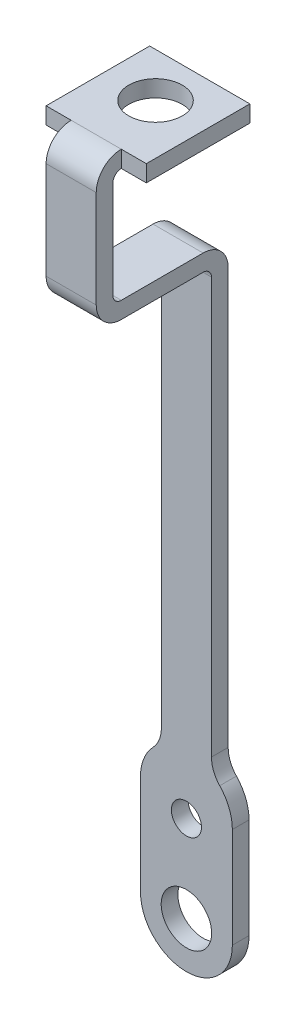
ISO-10303-21;
HEADER;
FILE_DESCRIPTION(('STEP AP214'),'2;1');
FILE_NAME('part.step','',(''),(''),'','','');
FILE_SCHEMA(('AUTOMOTIVE_DESIGN { 1 0 10303 214 1 1 1 1 }'));
ENDSEC;
DATA;
#1=APPLICATION_CONTEXT('core data for automotive mechanical design processes');
#2=APPLICATION_PROTOCOL_DEFINITION('international standard','automotive_design',2000,#1);
#3=PRODUCT_CONTEXT('',#1,'mechanical');
#4=PRODUCT('Part','Part','',(#3));
#5=PRODUCT_RELATED_PRODUCT_CATEGORY('part','',(#4));
#6=PRODUCT_DEFINITION_FORMATION('','',#4);
#7=PRODUCT_DEFINITION_CONTEXT('part definition',#1,'design');
#8=PRODUCT_DEFINITION('design','',#6,#7);
#9=PRODUCT_DEFINITION_SHAPE('','',#8);
#10=(LENGTH_UNIT() NAMED_UNIT(*) SI_UNIT(.MILLI.,.METRE.));
#11=(NAMED_UNIT(*) PLANE_ANGLE_UNIT() SI_UNIT($,.RADIAN.));
#12=(NAMED_UNIT(*) SI_UNIT($,.STERADIAN.) SOLID_ANGLE_UNIT());
#13=UNCERTAINTY_MEASURE_WITH_UNIT(LENGTH_MEASURE(1.E-05),#10,'distance_accuracy_value','');
#14=(GEOMETRIC_REPRESENTATION_CONTEXT(3) GLOBAL_UNCERTAINTY_ASSIGNED_CONTEXT((#13)) GLOBAL_UNIT_ASSIGNED_CONTEXT((#10,
#11,#12)) REPRESENTATION_CONTEXT('',''));
#15=CARTESIAN_POINT('',(0.,0.,0.));
#16=DIRECTION('',(0.,0.,1.));
#17=DIRECTION('',(1.,0.,0.));
#18=AXIS2_PLACEMENT_3D('',#15,#16,#17);
#19=CARTESIAN_POINT('',(-1.57295327545314E-12,-48.1509999999978,1.));
#20=DIRECTION('',(0.,0.,-1.));
#21=DIRECTION('',(-1.,0.,0.));
#22=AXIS2_PLACEMENT_3D('',#19,#20,#21);
#23=CYLINDRICAL_SURFACE('',#22,2.7499999999994);
#24=CARTESIAN_POINT('',(-1.57295327545314E-12,-48.1509999999978,0.));
#25=DIRECTION('',(0.,0.,1.));
#26=DIRECTION('',(1.,0.,0.));
#27=AXIS2_PLACEMENT_3D('',#24,#25,#26);
#28=CIRCLE('',#27,2.7499999999994);
#29=CARTESIAN_POINT('',(-2.75000000000148,-48.1509999999978,0.));
#30=VERTEX_POINT('',#29);
#31=CARTESIAN_POINT('',(2.75000000000148,-48.1509999999978,0.));
#32=VERTEX_POINT('',#31);
#33=EDGE_CURVE('E303',#30,#32,#28,.T.);
#34=ORIENTED_EDGE('',*,*,#33,.T.);
#35=DIRECTION('',(0.,0.,-1.));
#36=VECTOR('',#35,1.);
#37=CARTESIAN_POINT('',(2.75000000000148,-48.1509999999978,1.));
#38=LINE('',#37,#36);
#39=CARTESIAN_POINT('',(2.75000000000148,-48.1509999999978,1.));
#40=VERTEX_POINT('',#39);
#41=EDGE_CURVE('E246',#40,#32,#38,.T.);
#42=ORIENTED_EDGE('',*,*,#41,.F.);
#43=CARTESIAN_POINT('',(-1.57295327545314E-12,-48.1509999999978,1.));
#44=DIRECTION('',(0.,0.,1.));
#45=DIRECTION('',(1.,0.,0.));
#46=AXIS2_PLACEMENT_3D('',#43,#44,#45);
#47=CIRCLE('',#46,2.7499999999994);
#48=CARTESIAN_POINT('',(-2.75000000000148,-48.1509999999978,1.));
#49=VERTEX_POINT('',#48);
#50=EDGE_CURVE('E305',#49,#40,#47,.T.);
#51=ORIENTED_EDGE('',*,*,#50,.F.);
#52=DIRECTION('',(0.,0.,-1.));
#53=VECTOR('',#52,1.);
#54=CARTESIAN_POINT('',(-2.75000000000148,-48.1509999999978,1.));
#55=LINE('',#54,#53);
#56=EDGE_CURVE('E320',#49,#30,#55,.T.);
#57=ORIENTED_EDGE('',*,*,#56,.T.);
#58=EDGE_LOOP('',(#34,#42,#51,#57));
#59=FACE_BOUND('',#58,.T.);
#60=ADVANCED_FACE('F36',(#59),#23,.T.);
#61=CARTESIAN_POINT('',(-1.57295327545314E-12,-48.1509999999978,1.));
#62=DIRECTION('',(0.,0.,-1.));
#63=DIRECTION('',(-1.,0.,0.));
#64=AXIS2_PLACEMENT_3D('',#61,#62,#63);
#65=CYLINDRICAL_SURFACE('',#64,1.51000000000107);
#66=CARTESIAN_POINT('',(-1.57295327545314E-12,-48.1509999999978,0.));
#67=DIRECTION('',(0.,0.,-1.));
#68=DIRECTION('',(1.,0.,0.));
#69=AXIS2_PLACEMENT_3D('',#66,#67,#68);
#70=CIRCLE('',#69,1.51000000000107);
#71=CARTESIAN_POINT('',(1.5099999999995,-48.1509999999978,0.));
#72=VERTEX_POINT('',#71);
#73=EDGE_CURVE('E322',#72,#72,#70,.T.);
#74=ORIENTED_EDGE('',*,*,#73,.T.);
#75=EDGE_LOOP('',(#74));
#76=FACE_BOUND('',#75,.T.);
#77=CARTESIAN_POINT('',(-1.57295327545314E-12,-48.1509999999978,1.));
#78=DIRECTION('',(0.,0.,-1.));
#79=DIRECTION('',(1.,0.,0.));
#80=AXIS2_PLACEMENT_3D('',#77,#78,#79);
#81=CIRCLE('',#80,1.51000000000107);
#82=CARTESIAN_POINT('',(1.5099999999995,-48.1509999999978,1.));
#83=VERTEX_POINT('',#82);
#84=EDGE_CURVE('E307',#83,#83,#81,.T.);
#85=ORIENTED_EDGE('',*,*,#84,.F.);
#86=EDGE_LOOP('',(#85));
#87=FACE_BOUND('',#86,.T.);
#88=ADVANCED_FACE('F457',(#76,#87),#65,.F.);
#89=CARTESIAN_POINT('',(-3.49497688161806E-12,-42.9580299744084,1.));
#90=DIRECTION('',(0.,0.,-1.));
#91=DIRECTION('',(-1.,0.,0.));
#92=AXIS2_PLACEMENT_3D('',#89,#90,#91);
#93=CYLINDRICAL_SURFACE('',#92,0.899999999999998);
#94=CARTESIAN_POINT('',(-3.49497688161806E-12,-42.9580299744084,0.));
#95=DIRECTION('',(0.,0.,-1.));
#96=DIRECTION('',(1.,0.,0.));
#97=AXIS2_PLACEMENT_3D('',#94,#95,#96);
#98=CIRCLE('',#97,0.899999999999998);
#99=CARTESIAN_POINT('',(0.899999999996503,-42.9580299744084,0.));
#100=VERTEX_POINT('',#99);
#101=EDGE_CURVE('E325',#100,#100,#98,.T.);
#102=ORIENTED_EDGE('',*,*,#101,.T.);
#103=EDGE_LOOP('',(#102));
#104=FACE_BOUND('',#103,.T.);
#105=CARTESIAN_POINT('',(-3.49497688161806E-12,-42.9580299744084,1.));
#106=DIRECTION('',(0.,0.,-1.));
#107=DIRECTION('',(1.,0.,0.));
#108=AXIS2_PLACEMENT_3D('',#105,#106,#107);
#109=CIRCLE('',#108,0.899999999999998);
#110=CARTESIAN_POINT('',(0.899999999996503,-42.9580299744084,1.));
#111=VERTEX_POINT('',#110);
#112=EDGE_CURVE('E311',#111,#111,#109,.T.);
#113=ORIENTED_EDGE('',*,*,#112,.F.);
#114=EDGE_LOOP('',(#113));
#115=FACE_BOUND('',#114,.T.);
#116=ADVANCED_FACE('F463',(#104,#115),#93,.F.);
#117=CARTESIAN_POINT('',(-1.50000000000157,-12.6339999999955,1.));
#118=DIRECTION('',(0.,-1.,0.));
#119=DIRECTION('',(0.,0.,-1.));
#120=AXIS2_PLACEMENT_3D('',#117,#118,#119);
#121=PLANE('',#120);
#122=DIRECTION('',(0.,0.,-1.));
#123=VECTOR('',#122,1.);
#124=CARTESIAN_POINT('',(1.50000000000157,-12.6339999999955,1.));
#125=LINE('',#124,#123);
#126=CARTESIAN_POINT('',(1.50000000000157,-12.6339999999955,6.4));
#127=VERTEX_POINT('',#126);
#128=CARTESIAN_POINT('',(1.50000000000157,-12.6339999999955,1.5));
#129=VERTEX_POINT('',#128);
#130=EDGE_CURVE('E258',#127,#129,#125,.T.);
#131=ORIENTED_EDGE('',*,*,#130,.T.);
#132=DIRECTION('',(-1.,0.,0.));
#133=VECTOR('',#132,1.);
#134=CARTESIAN_POINT('',(-1.50000000000157,-12.6339999999955,1.5));
#135=LINE('',#134,#133);
#136=CARTESIAN_POINT('',(-1.50000000000157,-12.6339999999955,1.5));
#137=VERTEX_POINT('',#136);
#138=EDGE_CURVE('E379',#129,#137,#135,.T.);
#139=ORIENTED_EDGE('',*,*,#138,.T.);
#140=DIRECTION('',(0.,0.,-1.));
#141=VECTOR('',#140,1.);
#142=CARTESIAN_POINT('',(-1.50000000000157,-12.6339999999955,1.));
#143=LINE('',#142,#141);
#144=CARTESIAN_POINT('',(-1.50000000000157,-12.6339999999955,6.4));
#145=VERTEX_POINT('',#144);
#146=EDGE_CURVE('E338',#145,#137,#143,.T.);
#147=ORIENTED_EDGE('',*,*,#146,.F.);
#148=DIRECTION('',(1.,0.,0.));
#149=VECTOR('',#148,1.);
#150=CARTESIAN_POINT('',(-1.50000000000157,-12.6339999999955,6.4));
#151=LINE('',#150,#149);
#152=EDGE_CURVE('E364',#145,#127,#151,.T.);
#153=ORIENTED_EDGE('',*,*,#152,.T.);
#154=EDGE_LOOP('',(#131,#139,#147,#153));
#155=FACE_BOUND('',#154,.T.);
#156=ADVANCED_FACE('F539',(#155),#121,.F.);
#157=CARTESIAN_POINT('',(-1.50000000000157,-12.6339999999955,1.));
#158=DIRECTION('',(1.,0.,0.));
#159=DIRECTION('',(0.,1.,0.));
#160=AXIS2_PLACEMENT_3D('',#157,#158,#159);
#161=PLANE('',#160);
#162=ORIENTED_EDGE('',*,*,#146,.T.);
#163=CARTESIAN_POINT('',(-1.50000000000157,-14.1339999999955,1.5));
#164=DIRECTION('',(1.,0.,0.));
#165=DIRECTION('',(0.,1.,0.));
#166=AXIS2_PLACEMENT_3D('',#163,#164,#165);
#167=CIRCLE('',#166,1.5);
#168=CARTESIAN_POINT('',(-1.50000000000157,-14.1339999999955,0.));
#169=VERTEX_POINT('',#168);
#170=EDGE_CURVE('E386',#137,#169,#167,.F.);
#171=ORIENTED_EDGE('',*,*,#170,.T.);
#172=DIRECTION('',(0.,-1.,0.));
#173=VECTOR('',#172,1.);
#174=CARTESIAN_POINT('',(-1.50000000000157,-12.6339999999955,0.));
#175=LINE('',#174,#173);
#176=CARTESIAN_POINT('',(-1.50000000000157,-39.0185089784614,0.));
#177=VERTEX_POINT('',#176);
#178=EDGE_CURVE('E328',#169,#177,#175,.T.);
#179=ORIENTED_EDGE('',*,*,#178,.T.);
#180=DIRECTION('',(0.,0.,1.));
#181=VECTOR('',#180,1.);
#182=CARTESIAN_POINT('',(-1.50000000000157,-39.0185089784614,1.));
#183=LINE('',#182,#181);
#184=CARTESIAN_POINT('',(-1.50000000000157,-39.0185089784614,1.));
#185=VERTEX_POINT('',#184);
#186=EDGE_CURVE('E344',#177,#185,#183,.T.);
#187=ORIENTED_EDGE('',*,*,#186,.T.);
#188=DIRECTION('',(0.,-1.,0.));
#189=VECTOR('',#188,1.);
#190=CARTESIAN_POINT('',(-1.50000000000157,-12.6339999999955,1.));
#191=LINE('',#190,#189);
#192=CARTESIAN_POINT('',(-1.50000000000157,-14.1339999999955,1.));
#193=VERTEX_POINT('',#192);
#194=EDGE_CURVE('E314',#193,#185,#191,.T.);
#195=ORIENTED_EDGE('',*,*,#194,.F.);
#196=CARTESIAN_POINT('',(-1.50000000000157,-14.1339999999955,1.5));
#197=DIRECTION('',(1.,0.,0.));
#198=DIRECTION('',(0.,1.,0.));
#199=AXIS2_PLACEMENT_3D('',#196,#197,#198);
#200=CIRCLE('',#199,0.5);
#201=CARTESIAN_POINT('',(-1.50000000000157,-13.6339999999955,1.5));
#202=VERTEX_POINT('',#201);
#203=EDGE_CURVE('E369',#193,#202,#200,.T.);
#204=ORIENTED_EDGE('',*,*,#203,.T.);
#205=DIRECTION('',(0.,0.,1.));
#206=VECTOR('',#205,1.);
#207=CARTESIAN_POINT('',(-1.50000000000157,-13.6339999999955,0.));
#208=LINE('',#207,#206);
#209=CARTESIAN_POINT('',(-1.50000000000157,-13.6339999999955,6.4));
#210=VERTEX_POINT('',#209);
#211=EDGE_CURVE('E300',#202,#210,#208,.T.);
#212=ORIENTED_EDGE('',*,*,#211,.T.);
#213=CARTESIAN_POINT('',(-1.50000000000157,-12.1339999999955,6.4));
#214=DIRECTION('',(1.,0.,0.));
#215=DIRECTION('',(0.,1.,0.));
#216=AXIS2_PLACEMENT_3D('',#213,#214,#215);
#217=CIRCLE('',#216,1.5);
#218=CARTESIAN_POINT('',(-1.50000000000157,-12.1339999999955,7.9));
#219=VERTEX_POINT('',#218);
#220=EDGE_CURVE('E382',#210,#219,#217,.F.);
#221=ORIENTED_EDGE('',*,*,#220,.T.);
#222=DIRECTION('',(0.,1.,0.));
#223=VECTOR('',#222,1.);
#224=CARTESIAN_POINT('',(-1.50000000000157,-13.6339999999955,7.9));
#225=LINE('',#224,#223);
#226=CARTESIAN_POINT('',(-1.50000000000157,-6.29999999999704,7.9));
#227=VERTEX_POINT('',#226);
#228=EDGE_CURVE('E297',#219,#227,#225,.T.);
#229=ORIENTED_EDGE('',*,*,#228,.T.);
#230=CARTESIAN_POINT('',(-1.50000000000157,-6.29999999999704,6.4));
#231=DIRECTION('',(1.,0.,0.));
#232=DIRECTION('',(0.,1.,0.));
#233=AXIS2_PLACEMENT_3D('',#230,#231,#232);
#234=CIRCLE('',#233,1.5);
#235=CARTESIAN_POINT('',(-1.50000000000157,-4.79999999999704,6.4));
#236=VERTEX_POINT('',#235);
#237=EDGE_CURVE('E384',#227,#236,#234,.F.);
#238=ORIENTED_EDGE('',*,*,#237,.T.);
#239=DIRECTION('',(0.,1.,0.));
#240=VECTOR('',#239,1.);
#241=CARTESIAN_POINT('',(-1.50000000000157,-12.1788713735235,6.4));
#242=LINE('',#241,#240);
#243=CARTESIAN_POINT('',(-1.50000000000157,-5.79999999999704,6.4));
#244=VERTEX_POINT('',#243);
#245=EDGE_CURVE('E208',#244,#236,#242,.T.);
#246=ORIENTED_EDGE('',*,*,#245,.F.);
#247=CARTESIAN_POINT('',(-1.50000000000157,-6.29999999999704,6.4));
#248=DIRECTION('',(1.,0.,0.));
#249=DIRECTION('',(0.,1.,0.));
#250=AXIS2_PLACEMENT_3D('',#247,#248,#249);
#251=CIRCLE('',#250,0.5);
#252=CARTESIAN_POINT('',(-1.50000000000157,-6.29999999999704,6.9));
#253=VERTEX_POINT('',#252);
#254=EDGE_CURVE('E373',#244,#253,#251,.T.);
#255=ORIENTED_EDGE('',*,*,#254,.T.);
#256=DIRECTION('',(0.,-1.,0.));
#257=VECTOR('',#256,1.);
#258=CARTESIAN_POINT('',(-1.50000000000157,-12.6339999999955,6.9));
#259=LINE('',#258,#257);
#260=CARTESIAN_POINT('',(-1.50000000000157,-12.1339999999955,6.9));
#261=VERTEX_POINT('',#260);
#262=EDGE_CURVE('E294',#253,#261,#259,.T.);
#263=ORIENTED_EDGE('',*,*,#262,.T.);
#264=CARTESIAN_POINT('',(-1.50000000000157,-12.1339999999955,6.4));
#265=DIRECTION('',(1.,0.,0.));
#266=DIRECTION('',(0.,1.,0.));
#267=AXIS2_PLACEMENT_3D('',#264,#265,#266);
#268=CIRCLE('',#267,0.5);
#269=EDGE_CURVE('E377',#261,#145,#268,.T.);
#270=ORIENTED_EDGE('',*,*,#269,.T.);
#271=EDGE_LOOP('',(#162,#171,#179,#187,#195,#204,#212,#221,#229,#238,#246,#255,#263,#270));
#272=FACE_BOUND('',#271,.T.);
#273=ADVANCED_FACE('F407',(#272),#161,.F.);
#274=CARTESIAN_POINT('',(-2.49856129121515E-12,-42.1509999999963,1.));
#275=DIRECTION('',(0.,0.,-1.));
#276=DIRECTION('',(-1.,0.,0.));
#277=AXIS2_PLACEMENT_3D('',#274,#275,#276);
#278=CYLINDRICAL_SURFACE('',#277,2.74999999999895);
#279=CARTESIAN_POINT('',(-2.49856129121515E-12,-42.1509999999963,1.));
#280=DIRECTION('',(0.,0.,1.));
#281=DIRECTION('',(1.,0.,0.));
#282=AXIS2_PLACEMENT_3D('',#279,#280,#281);
#283=CIRCLE('',#282,2.74999999999895);
#284=CARTESIAN_POINT('',(-1.99450549450713,-40.2577361957722,1.));
#285=VERTEX_POINT('',#284);
#286=CARTESIAN_POINT('',(-2.75000000000145,-42.1509999999963,1.));
#287=VERTEX_POINT('',#286);
#288=EDGE_CURVE('E316',#285,#287,#283,.T.);
#289=ORIENTED_EDGE('',*,*,#288,.F.);
#290=DIRECTION('',(0.,0.,-1.));
#291=VECTOR('',#290,1.);
#292=CARTESIAN_POINT('',(-1.99450549450713,-40.2577361957722,1.));
#293=LINE('',#292,#291);
#294=CARTESIAN_POINT('',(-1.99450549450713,-40.2577361957722,0.));
#295=VERTEX_POINT('',#294);
#296=EDGE_CURVE('E341',#285,#295,#293,.T.);
#297=ORIENTED_EDGE('',*,*,#296,.T.);
#298=CARTESIAN_POINT('',(-2.49856129121515E-12,-42.1509999999963,0.));
#299=DIRECTION('',(0.,0.,1.));
#300=DIRECTION('',(1.,0.,0.));
#301=AXIS2_PLACEMENT_3D('',#298,#299,#300);
#302=CIRCLE('',#301,2.74999999999895);
#303=CARTESIAN_POINT('',(-2.75000000000145,-42.1509999999963,0.));
#304=VERTEX_POINT('',#303);
#305=EDGE_CURVE('E330',#295,#304,#302,.T.);
#306=ORIENTED_EDGE('',*,*,#305,.T.);
#307=DIRECTION('',(0.,0.,-1.));
#308=VECTOR('',#307,1.);
#309=CARTESIAN_POINT('',(-2.75000000000145,-42.1509999999963,1.));
#310=LINE('',#309,#308);
#311=EDGE_CURVE('E335',#287,#304,#310,.T.);
#312=ORIENTED_EDGE('',*,*,#311,.F.);
#313=EDGE_LOOP('',(#289,#297,#306,#312));
#314=FACE_BOUND('',#313,.T.);
#315=ADVANCED_FACE('F491',(#314),#278,.T.);
#316=CARTESIAN_POINT('',(-2.75000000000148,-48.1509999999978,1.));
#317=DIRECTION('',(1.,0.,0.));
#318=DIRECTION('',(0.,0.,-1.));
#319=AXIS2_PLACEMENT_3D('',#316,#317,#318);
#320=PLANE('',#319);
#321=DIRECTION('',(0.,-1.,0.));
#322=VECTOR('',#321,1.);
#323=CARTESIAN_POINT('',(-2.75000000000148,-48.1509999999978,0.));
#324=LINE('',#323,#322);
#325=EDGE_CURVE('E308',#304,#30,#324,.T.);
#326=ORIENTED_EDGE('',*,*,#325,.T.);
#327=ORIENTED_EDGE('',*,*,#56,.F.);
#328=DIRECTION('',(0.,-1.,0.));
#329=VECTOR('',#328,1.);
#330=CARTESIAN_POINT('',(-2.75000000000148,-48.1509999999978,1.));
#331=LINE('',#330,#329);
#332=EDGE_CURVE('E318',#287,#49,#331,.T.);
#333=ORIENTED_EDGE('',*,*,#332,.F.);
#334=ORIENTED_EDGE('',*,*,#311,.T.);
#335=EDGE_LOOP('',(#326,#327,#333,#334));
#336=FACE_BOUND('',#335,.T.);
#337=ADVANCED_FACE('F497',(#336),#320,.F.);
#338=CARTESIAN_POINT('',(-1.57295327545314E-12,-48.1509999999978,1.));
#339=DIRECTION('',(0.,0.,1.));
#340=DIRECTION('',(1.,0.,0.));
#341=AXIS2_PLACEMENT_3D('',#338,#339,#340);
#342=PLANE('',#341);
#343=DIRECTION('',(0.,-1.,0.));
#344=VECTOR('',#343,1.);
#345=CARTESIAN_POINT('',(1.50000000000157,-12.6339999999955,1.));
#346=LINE('',#345,#344);
#347=CARTESIAN_POINT('',(1.50000000000157,-14.1339999999955,1.));
#348=VERTEX_POINT('',#347);
#349=CARTESIAN_POINT('',(1.50000000000157,-39.0185089784614,1.));
#350=VERTEX_POINT('',#349);
#351=EDGE_CURVE('E237',#348,#350,#346,.T.);
#352=ORIENTED_EDGE('',*,*,#351,.F.);
#353=DIRECTION('',(1.,0.,0.));
#354=VECTOR('',#353,1.);
#355=CARTESIAN_POINT('',(-1.50000000000157,-14.1339999999955,1.));
#356=LINE('',#355,#354);
#357=EDGE_CURVE('E355',#348,#193,#356,.F.);
#358=ORIENTED_EDGE('',*,*,#357,.T.);
#359=ORIENTED_EDGE('',*,*,#194,.T.);
#360=CARTESIAN_POINT('',(-3.30000000000157,-39.0185089784614,1.));
#361=DIRECTION('',(0.,0.,1.));
#362=DIRECTION('',(1.,0.,0.));
#363=AXIS2_PLACEMENT_3D('',#360,#361,#362);
#364=CIRCLE('',#363,1.8);
#365=EDGE_CURVE('E350',#185,#285,#364,.F.);
#366=ORIENTED_EDGE('',*,*,#365,.T.);
#367=ORIENTED_EDGE('',*,*,#288,.T.);
#368=ORIENTED_EDGE('',*,*,#332,.T.);
#369=ORIENTED_EDGE('',*,*,#50,.T.);
#370=DIRECTION('',(0.,-1.,0.));
#371=VECTOR('',#370,1.);
#372=CARTESIAN_POINT('',(2.75000000000148,-48.1509999999978,1.));
#373=LINE('',#372,#371);
#374=CARTESIAN_POINT('',(2.75000000000145,-42.1509999999963,1.));
#375=VERTEX_POINT('',#374);
#376=EDGE_CURVE('E243',#375,#40,#373,.T.);
#377=ORIENTED_EDGE('',*,*,#376,.F.);
#378=CARTESIAN_POINT('',(2.49856129121515E-12,-42.1509999999963,1.));
#379=DIRECTION('',(0.,0.,-1.));
#380=DIRECTION('',(-1.,0.,0.));
#381=AXIS2_PLACEMENT_3D('',#378,#379,#380);
#382=CIRCLE('',#381,2.74999999999895);
#383=CARTESIAN_POINT('',(1.99450549450713,-40.2577361957722,1.));
#384=VERTEX_POINT('',#383);
#385=EDGE_CURVE('E239',#384,#375,#382,.T.);
#386=ORIENTED_EDGE('',*,*,#385,.F.);
#387=CARTESIAN_POINT('',(3.30000000000157,-39.0185089784614,1.));
#388=DIRECTION('',(0.,0.,-1.));
#389=DIRECTION('',(-1.,0.,0.));
#390=AXIS2_PLACEMENT_3D('',#387,#388,#389);
#391=CIRCLE('',#390,1.8);
#392=EDGE_CURVE('E270',#350,#384,#391,.F.);
#393=ORIENTED_EDGE('',*,*,#392,.F.);
#394=EDGE_LOOP('',(#352,#358,#359,#366,#367,#368,#369,#377,#386,#393));
#395=FACE_BOUND('',#394,.T.);
#396=ORIENTED_EDGE('',*,*,#84,.T.);
#397=EDGE_LOOP('',(#396));
#398=FACE_BOUND('',#397,.T.);
#399=ORIENTED_EDGE('',*,*,#112,.T.);
#400=EDGE_LOOP('',(#399));
#401=FACE_BOUND('',#400,.T.);
#402=ADVANCED_FACE('F486',(#395,#398,#401),#342,.T.);
#403=CARTESIAN_POINT('',(-1.57295327545314E-12,-48.1509999999978,0.));
#404=DIRECTION('',(0.,0.,1.));
#405=DIRECTION('',(1.,0.,0.));
#406=AXIS2_PLACEMENT_3D('',#403,#404,#405);
#407=PLANE('',#406);
#408=ORIENTED_EDGE('',*,*,#178,.F.);
#409=DIRECTION('',(-1.,0.,0.));
#410=VECTOR('',#409,1.);
#411=CARTESIAN_POINT('',(-1.57295327545314E-12,-14.1339999999955,0.));
#412=LINE('',#411,#410);
#413=CARTESIAN_POINT('',(1.50000000000157,-14.1339999999955,0.));
#414=VERTEX_POINT('',#413);
#415=EDGE_CURVE('E388',#169,#414,#412,.F.);
#416=ORIENTED_EDGE('',*,*,#415,.T.);
#417=DIRECTION('',(0.,-1.,0.));
#418=VECTOR('',#417,1.);
#419=CARTESIAN_POINT('',(1.50000000000157,-12.6339999999955,0.));
#420=LINE('',#419,#418);
#421=CARTESIAN_POINT('',(1.50000000000157,-39.0185089784614,0.));
#422=VERTEX_POINT('',#421);
#423=EDGE_CURVE('E236',#414,#422,#420,.T.);
#424=ORIENTED_EDGE('',*,*,#423,.T.);
#425=CARTESIAN_POINT('',(3.30000000000157,-39.0185089784614,0.));
#426=DIRECTION('',(0.,0.,-1.));
#427=DIRECTION('',(-1.,0.,0.));
#428=AXIS2_PLACEMENT_3D('',#425,#426,#427);
#429=CIRCLE('',#428,1.8);
#430=CARTESIAN_POINT('',(1.99450549450713,-40.2577361957722,0.));
#431=VERTEX_POINT('',#430);
#432=EDGE_CURVE('E267',#431,#422,#429,.T.);
#433=ORIENTED_EDGE('',*,*,#432,.F.);
#434=CARTESIAN_POINT('',(2.49856129121515E-12,-42.1509999999963,0.));
#435=DIRECTION('',(0.,0.,-1.));
#436=DIRECTION('',(-1.,0.,0.));
#437=AXIS2_PLACEMENT_3D('',#434,#435,#436);
#438=CIRCLE('',#437,2.74999999999895);
#439=CARTESIAN_POINT('',(2.75000000000145,-42.1509999999963,0.));
#440=VERTEX_POINT('',#439);
#441=EDGE_CURVE('E248',#431,#440,#438,.T.);
#442=ORIENTED_EDGE('',*,*,#441,.T.);
#443=DIRECTION('',(0.,-1.,0.));
#444=VECTOR('',#443,1.);
#445=CARTESIAN_POINT('',(2.75000000000148,-48.1509999999978,0.));
#446=LINE('',#445,#444);
#447=EDGE_CURVE('E240',#440,#32,#446,.T.);
#448=ORIENTED_EDGE('',*,*,#447,.T.);
#449=ORIENTED_EDGE('',*,*,#33,.F.);
#450=ORIENTED_EDGE('',*,*,#325,.F.);
#451=ORIENTED_EDGE('',*,*,#305,.F.);
#452=CARTESIAN_POINT('',(-3.30000000000157,-39.0185089784614,0.));
#453=DIRECTION('',(0.,0.,1.));
#454=DIRECTION('',(1.,0.,0.));
#455=AXIS2_PLACEMENT_3D('',#452,#453,#454);
#456=CIRCLE('',#455,1.8);
#457=EDGE_CURVE('E347',#295,#177,#456,.T.);
#458=ORIENTED_EDGE('',*,*,#457,.T.);
#459=EDGE_LOOP('',(#408,#416,#424,#433,#442,#448,#449,#450,#451,#458));
#460=FACE_BOUND('',#459,.T.);
#461=ORIENTED_EDGE('',*,*,#73,.F.);
#462=EDGE_LOOP('',(#461));
#463=FACE_BOUND('',#462,.T.);
#464=ORIENTED_EDGE('',*,*,#101,.F.);
#465=EDGE_LOOP('',(#464));
#466=FACE_BOUND('',#465,.T.);
#467=ADVANCED_FACE('F507',(#460,#463,#466),#407,.F.);
#468=CARTESIAN_POINT('',(-13.3511415483914,-13.6339999999955,0.));
#469=DIRECTION('',(0.,-1.,0.));
#470=DIRECTION('',(0.,0.,-1.));
#471=AXIS2_PLACEMENT_3D('',#468,#469,#470);
#472=PLANE('',#471);
#473=DIRECTION('',(0.,0.,1.));
#474=VECTOR('',#473,1.);
#475=CARTESIAN_POINT('',(1.50000000000157,-13.6339999999955,0.));
#476=LINE('',#475,#474);
#477=CARTESIAN_POINT('',(1.50000000000157,-13.6339999999955,1.5));
#478=VERTEX_POINT('',#477);
#479=CARTESIAN_POINT('',(1.50000000000157,-13.6339999999955,6.4));
#480=VERTEX_POINT('',#479);
#481=EDGE_CURVE('E234',#478,#480,#476,.T.);
#482=ORIENTED_EDGE('',*,*,#481,.T.);
#483=DIRECTION('',(1.,0.,0.));
#484=VECTOR('',#483,1.);
#485=CARTESIAN_POINT('',(-13.3511415483914,-13.6339999999955,6.4));
#486=LINE('',#485,#484);
#487=EDGE_CURVE('E12',#480,#210,#486,.F.);
#488=ORIENTED_EDGE('',*,*,#487,.T.);
#489=ORIENTED_EDGE('',*,*,#211,.F.);
#490=DIRECTION('',(1.,0.,0.));
#491=VECTOR('',#490,1.);
#492=CARTESIAN_POINT('',(1.50000000000157,-13.6339999999955,1.5));
#493=LINE('',#492,#491);
#494=EDGE_CURVE('E352',#202,#478,#493,.T.);
#495=ORIENTED_EDGE('',*,*,#494,.T.);
#496=EDGE_LOOP('',(#482,#488,#489,#495));
#497=FACE_BOUND('',#496,.T.);
#498=ADVANCED_FACE('F521',(#497),#472,.T.);
#499=CARTESIAN_POINT('',(-13.3511415483914,-13.6339999999955,7.9));
#500=DIRECTION('',(0.,0.,1.));
#501=DIRECTION('',(1.,0.,0.));
#502=AXIS2_PLACEMENT_3D('',#499,#500,#501);
#503=PLANE('',#502);
#504=DIRECTION('',(0.,1.,0.));
#505=VECTOR('',#504,1.);
#506=CARTESIAN_POINT('',(1.50000000000157,-13.6339999999955,7.9));
#507=LINE('',#506,#505);
#508=CARTESIAN_POINT('',(1.50000000000157,-12.1339999999955,7.9));
#509=VERTEX_POINT('',#508);
#510=CARTESIAN_POINT('',(1.50000000000157,-6.29999999999704,7.9));
#511=VERTEX_POINT('',#510);
#512=EDGE_CURVE('E231',#509,#511,#507,.T.);
#513=ORIENTED_EDGE('',*,*,#512,.T.);
#514=DIRECTION('',(1.,0.,0.));
#515=VECTOR('',#514,1.);
#516=CARTESIAN_POINT('',(-13.3511415483914,-6.29999999999704,7.9));
#517=LINE('',#516,#515);
#518=EDGE_CURVE('E44',#511,#227,#517,.F.);
#519=ORIENTED_EDGE('',*,*,#518,.T.);
#520=ORIENTED_EDGE('',*,*,#228,.F.);
#521=DIRECTION('',(1.,0.,0.));
#522=VECTOR('',#521,1.);
#523=CARTESIAN_POINT('',(-13.3511415483914,-12.1339999999955,7.9));
#524=LINE('',#523,#522);
#525=EDGE_CURVE('E397',#219,#509,#524,.T.);
#526=ORIENTED_EDGE('',*,*,#525,.T.);
#527=EDGE_LOOP('',(#513,#519,#520,#526));
#528=FACE_BOUND('',#527,.T.);
#529=ADVANCED_FACE('F402',(#528),#503,.T.);
#530=CARTESIAN_POINT('',(-13.3511415483914,-4.79999999999704,7.9));
#531=DIRECTION('',(0.,1.,0.));
#532=DIRECTION('',(-1.,0.,0.));
#533=AXIS2_PLACEMENT_3D('',#530,#531,#532);
#534=PLANE('',#533);
#535=DIRECTION('',(1.,0.,0.));
#536=VECTOR('',#535,1.);
#537=CARTESIAN_POINT('',(-1.50000000000157,-4.79999999999704,6.4));
#538=LINE('',#537,#536);
#539=CARTESIAN_POINT('',(-3.,-4.79999999999704,6.4));
#540=VERTEX_POINT('',#539);
#541=EDGE_CURVE('E279',#540,#236,#538,.T.);
#542=ORIENTED_EDGE('',*,*,#541,.T.);
#543=DIRECTION('',(1.,0.,0.));
#544=VECTOR('',#543,1.);
#545=CARTESIAN_POINT('',(-13.3511415483914,-4.79999999999704,6.4));
#546=LINE('',#545,#544);
#547=CARTESIAN_POINT('',(1.50000000000157,-4.79999999999704,6.4));
#548=VERTEX_POINT('',#547);
#549=EDGE_CURVE('E394',#236,#548,#546,.T.);
#550=ORIENTED_EDGE('',*,*,#549,.T.);
#551=DIRECTION('',(-1.,0.,0.));
#552=VECTOR('',#551,1.);
#553=CARTESIAN_POINT('',(1.50000000000157,-4.79999999999704,6.4));
#554=LINE('',#553,#552);
#555=CARTESIAN_POINT('',(3.,-4.79999999999704,6.4));
#556=VERTEX_POINT('',#555);
#557=EDGE_CURVE('E220',#556,#548,#554,.T.);
#558=ORIENTED_EDGE('',*,*,#557,.F.);
#559=DIRECTION('',(0.,0.,1.));
#560=VECTOR('',#559,1.);
#561=CARTESIAN_POINT('',(3.,-4.79999999999704,6.4));
#562=LINE('',#561,#560);
#563=CARTESIAN_POINT('',(3.,-4.79999999999704,0.2));
#564=VERTEX_POINT('',#563);
#565=EDGE_CURVE('E223',#564,#556,#562,.T.);
#566=ORIENTED_EDGE('',*,*,#565,.F.);
#567=DIRECTION('',(1.,0.,0.));
#568=VECTOR('',#567,1.);
#569=CARTESIAN_POINT('',(-13.3511415483914,-4.79999999999704,0.2));
#570=LINE('',#569,#568);
#571=CARTESIAN_POINT('',(-3.,-4.79999999999704,0.2));
#572=VERTEX_POINT('',#571);
#573=EDGE_CURVE('E207',#572,#564,#570,.T.);
#574=ORIENTED_EDGE('',*,*,#573,.F.);
#575=DIRECTION('',(0.,0.,1.));
#576=VECTOR('',#575,1.);
#577=CARTESIAN_POINT('',(-3.,-4.79999999999704,6.4));
#578=LINE('',#577,#576);
#579=EDGE_CURVE('E276',#572,#540,#578,.T.);
#580=ORIENTED_EDGE('',*,*,#579,.T.);
#581=EDGE_LOOP('',(#542,#550,#558,#566,#574,#580));
#582=FACE_BOUND('',#581,.T.);
#583=CARTESIAN_POINT('',(-5.54297353342841E-12,-4.79999999999704,2.85000000000437));
#584=DIRECTION('',(0.,1.,0.));
#585=DIRECTION('',(-1.,0.,0.));
#586=AXIS2_PLACEMENT_3D('',#583,#584,#585);
#587=CIRCLE('',#586,1.6);
#588=CARTESIAN_POINT('',(-1.60000000000554,-4.79999999999704,2.85000000000437));
#589=VERTEX_POINT('',#588);
#590=EDGE_CURVE('E272',#589,#589,#587,.T.);
#591=ORIENTED_EDGE('',*,*,#590,.F.);
#592=EDGE_LOOP('',(#591));
#593=FACE_BOUND('',#592,.T.);
#594=ADVANCED_FACE('F414',(#582,#593),#534,.T.);
#595=CARTESIAN_POINT('',(-13.3511415483914,-5.79999999999704,0.2));
#596=DIRECTION('',(0.,0.,-1.));
#597=DIRECTION('',(-1.,0.,0.));
#598=AXIS2_PLACEMENT_3D('',#595,#596,#597);
#599=PLANE('',#598);
#600=DIRECTION('',(1.,0.,0.));
#601=VECTOR('',#600,1.);
#602=CARTESIAN_POINT('',(-13.3511415483914,-5.79999999999704,0.2));
#603=LINE('',#602,#601);
#604=CARTESIAN_POINT('',(-3.,-5.79999999999704,0.2));
#605=VERTEX_POINT('',#604);
#606=CARTESIAN_POINT('',(3.,-5.79999999999704,0.2));
#607=VERTEX_POINT('',#606);
#608=EDGE_CURVE('E196',#605,#607,#603,.T.);
#609=ORIENTED_EDGE('',*,*,#608,.F.);
#610=DIRECTION('',(0.,1.,0.));
#611=VECTOR('',#610,1.);
#612=CARTESIAN_POINT('',(-3.,-12.1788713735235,0.2));
#613=LINE('',#612,#611);
#614=EDGE_CURVE('E282',#605,#572,#613,.T.);
#615=ORIENTED_EDGE('',*,*,#614,.T.);
#616=ORIENTED_EDGE('',*,*,#573,.T.);
#617=DIRECTION('',(0.,1.,0.));
#618=VECTOR('',#617,1.);
#619=CARTESIAN_POINT('',(3.,-12.1788713735235,0.2));
#620=LINE('',#619,#618);
#621=EDGE_CURVE('E214',#607,#564,#620,.T.);
#622=ORIENTED_EDGE('',*,*,#621,.F.);
#623=EDGE_LOOP('',(#609,#615,#616,#622));
#624=FACE_BOUND('',#623,.T.);
#625=ADVANCED_FACE('F219',(#624),#599,.T.);
#626=CARTESIAN_POINT('',(-13.3511415483914,-5.79999999999704,6.9));
#627=DIRECTION('',(0.,-1.,0.));
#628=DIRECTION('',(1.,0.,0.));
#629=AXIS2_PLACEMENT_3D('',#626,#627,#628);
#630=PLANE('',#629);
#631=CARTESIAN_POINT('',(-5.5429719716604E-12,-5.79999999999704,2.85000000000437));
#632=DIRECTION('',(0.,-1.,0.));
#633=DIRECTION('',(1.,0.,0.));
#634=AXIS2_PLACEMENT_3D('',#631,#632,#633);
#635=CIRCLE('',#634,1.6);
#636=CARTESIAN_POINT('',(1.59999999999446,-5.79999999999704,2.85000000000437));
#637=VERTEX_POINT('',#636);
#638=EDGE_CURVE('E273',#637,#637,#635,.F.);
#639=ORIENTED_EDGE('',*,*,#638,.T.);
#640=EDGE_LOOP('',(#639));
#641=FACE_BOUND('',#640,.T.);
#642=DIRECTION('',(-1.,0.,0.));
#643=VECTOR('',#642,1.);
#644=CARTESIAN_POINT('',(1.50000000000157,-5.79999999999704,6.4));
#645=LINE('',#644,#643);
#646=CARTESIAN_POINT('',(3.,-5.79999999999704,6.4));
#647=VERTEX_POINT('',#646);
#648=CARTESIAN_POINT('',(1.50000000000157,-5.79999999999704,6.4));
#649=VERTEX_POINT('',#648);
#650=EDGE_CURVE('E424',#647,#649,#645,.T.);
#651=ORIENTED_EDGE('',*,*,#650,.T.);
#652=DIRECTION('',(1.,0.,0.));
#653=VECTOR('',#652,1.);
#654=CARTESIAN_POINT('',(-1.50000000000157,-5.79999999999704,6.4));
#655=LINE('',#654,#653);
#656=EDGE_CURVE('E362',#649,#244,#655,.F.);
#657=ORIENTED_EDGE('',*,*,#656,.T.);
#658=DIRECTION('',(1.,0.,0.));
#659=VECTOR('',#658,1.);
#660=CARTESIAN_POINT('',(-1.50000000000157,-5.79999999999704,6.4));
#661=LINE('',#660,#659);
#662=CARTESIAN_POINT('',(-3.,-5.79999999999704,6.4));
#663=VERTEX_POINT('',#662);
#664=EDGE_CURVE('E285',#663,#244,#661,.T.);
#665=ORIENTED_EDGE('',*,*,#664,.F.);
#666=DIRECTION('',(0.,0.,1.));
#667=VECTOR('',#666,1.);
#668=CARTESIAN_POINT('',(-3.,-5.79999999999704,6.4));
#669=LINE('',#668,#667);
#670=EDGE_CURVE('E202',#605,#663,#669,.T.);
#671=ORIENTED_EDGE('',*,*,#670,.F.);
#672=ORIENTED_EDGE('',*,*,#608,.T.);
#673=DIRECTION('',(0.,0.,1.));
#674=VECTOR('',#673,1.);
#675=CARTESIAN_POINT('',(3.,-5.79999999999704,6.4));
#676=LINE('',#675,#674);
#677=EDGE_CURVE('E200',#607,#647,#676,.T.);
#678=ORIENTED_EDGE('',*,*,#677,.T.);
#679=EDGE_LOOP('',(#651,#657,#665,#671,#672,#678));
#680=FACE_BOUND('',#679,.T.);
#681=ADVANCED_FACE('F199',(#641,#680),#630,.T.);
#682=CARTESIAN_POINT('',(-13.3511415483914,-12.6339999999955,6.9));
#683=DIRECTION('',(0.,0.,-1.));
#684=DIRECTION('',(-1.,0.,0.));
#685=AXIS2_PLACEMENT_3D('',#682,#683,#684);
#686=PLANE('',#685);
#687=ORIENTED_EDGE('',*,*,#262,.F.);
#688=DIRECTION('',(1.,0.,0.));
#689=VECTOR('',#688,1.);
#690=CARTESIAN_POINT('',(1.50000000000157,-6.29999999999704,6.9));
#691=LINE('',#690,#689);
#692=CARTESIAN_POINT('',(1.50000000000157,-6.29999999999704,6.9));
#693=VERTEX_POINT('',#692);
#694=EDGE_CURVE('E359',#253,#693,#691,.T.);
#695=ORIENTED_EDGE('',*,*,#694,.T.);
#696=DIRECTION('',(0.,-1.,0.));
#697=VECTOR('',#696,1.);
#698=CARTESIAN_POINT('',(1.50000000000157,-12.6339999999955,6.9));
#699=LINE('',#698,#697);
#700=CARTESIAN_POINT('',(1.50000000000157,-12.1339999999955,6.9));
#701=VERTEX_POINT('',#700);
#702=EDGE_CURVE('E228',#693,#701,#699,.T.);
#703=ORIENTED_EDGE('',*,*,#702,.T.);
#704=DIRECTION('',(1.,0.,0.));
#705=VECTOR('',#704,1.);
#706=CARTESIAN_POINT('',(-13.3511415483914,-12.1339999999955,6.9));
#707=LINE('',#706,#705);
#708=EDGE_CURVE('E357',#701,#261,#707,.F.);
#709=ORIENTED_EDGE('',*,*,#708,.T.);
#710=EDGE_LOOP('',(#687,#695,#703,#709));
#711=FACE_BOUND('',#710,.T.);
#712=ADVANCED_FACE('F439',(#711),#686,.T.);
#713=CARTESIAN_POINT('',(-3.,-12.1788713735235,6.4));
#714=DIRECTION('',(-1.,0.,0.));
#715=DIRECTION('',(0.,-1.,0.));
#716=AXIS2_PLACEMENT_3D('',#713,#714,#715);
#717=PLANE('',#716);
#718=ORIENTED_EDGE('',*,*,#614,.F.);
#719=ORIENTED_EDGE('',*,*,#670,.T.);
#720=DIRECTION('',(0.,1.,0.));
#721=VECTOR('',#720,1.);
#722=CARTESIAN_POINT('',(-3.,-12.1788713735235,6.4));
#723=LINE('',#722,#721);
#724=EDGE_CURVE('E288',#663,#540,#723,.T.);
#725=ORIENTED_EDGE('',*,*,#724,.T.);
#726=ORIENTED_EDGE('',*,*,#579,.F.);
#727=EDGE_LOOP('',(#718,#719,#725,#726));
#728=FACE_BOUND('',#727,.T.);
#729=ADVANCED_FACE('F429',(#728),#717,.T.);
#730=CARTESIAN_POINT('',(-1.50000000000157,-12.1788713735235,6.4));
#731=DIRECTION('',(0.,0.,1.));
#732=DIRECTION('',(1.,0.,0.));
#733=AXIS2_PLACEMENT_3D('',#730,#731,#732);
#734=PLANE('',#733);
#735=ORIENTED_EDGE('',*,*,#724,.F.);
#736=ORIENTED_EDGE('',*,*,#664,.T.);
#737=ORIENTED_EDGE('',*,*,#245,.T.);
#738=ORIENTED_EDGE('',*,*,#541,.F.);
#739=EDGE_LOOP('',(#735,#736,#737,#738));
#740=FACE_BOUND('',#739,.T.);
#741=ADVANCED_FACE('F432',(#740),#734,.T.);
#742=CARTESIAN_POINT('',(-5.54290153279918E-12,-50.9019999999972,2.85000000000437));
#743=DIRECTION('',(0.,1.,0.));
#744=DIRECTION('',(-1.,0.,0.));
#745=AXIS2_PLACEMENT_3D('',#742,#743,#744);
#746=CYLINDRICAL_SURFACE('',#745,1.6);
#747=ORIENTED_EDGE('',*,*,#638,.F.);
#748=EDGE_LOOP('',(#747));
#749=FACE_BOUND('',#748,.T.);
#750=ORIENTED_EDGE('',*,*,#590,.T.);
#751=EDGE_LOOP('',(#750));
#752=FACE_BOUND('',#751,.T.);
#753=ADVANCED_FACE('F470',(#749,#752),#746,.F.);
#754=CARTESIAN_POINT('',(-3.30000000000157,-39.0185089784614,1.));
#755=DIRECTION('',(0.,0.,-1.));
#756=DIRECTION('',(-1.,0.,0.));
#757=AXIS2_PLACEMENT_3D('',#754,#755,#756);
#758=CYLINDRICAL_SURFACE('',#757,1.8);
#759=ORIENTED_EDGE('',*,*,#365,.F.);
#760=ORIENTED_EDGE('',*,*,#186,.F.);
#761=ORIENTED_EDGE('',*,*,#457,.F.);
#762=ORIENTED_EDGE('',*,*,#296,.F.);
#763=EDGE_LOOP('',(#759,#760,#761,#762));
#764=FACE_BOUND('',#763,.T.);
#765=ADVANCED_FACE('F468',(#764),#758,.F.);
#766=CARTESIAN_POINT('',(1.50000000000157,-12.6339999999955,1.));
#767=DIRECTION('',(-1.,0.,0.));
#768=DIRECTION('',(0.,1.,0.));
#769=AXIS2_PLACEMENT_3D('',#766,#767,#768);
#770=PLANE('',#769);
#771=ORIENTED_EDGE('',*,*,#423,.F.);
#772=CARTESIAN_POINT('',(1.50000000000157,-14.1339999999955,1.5));
#773=DIRECTION('',(-1.,0.,0.));
#774=DIRECTION('',(0.,-1.,0.));
#775=AXIS2_PLACEMENT_3D('',#772,#773,#774);
#776=CIRCLE('',#775,1.5);
#777=EDGE_CURVE('E392',#414,#129,#776,.F.);
#778=ORIENTED_EDGE('',*,*,#777,.T.);
#779=ORIENTED_EDGE('',*,*,#130,.F.);
#780=CARTESIAN_POINT('',(1.50000000000157,-12.1339999999955,6.4));
#781=DIRECTION('',(-1.,0.,0.));
#782=DIRECTION('',(0.,-1.,0.));
#783=AXIS2_PLACEMENT_3D('',#780,#781,#782);
#784=CIRCLE('',#783,0.5);
#785=EDGE_CURVE('E375',#127,#701,#784,.T.);
#786=ORIENTED_EDGE('',*,*,#785,.T.);
#787=ORIENTED_EDGE('',*,*,#702,.F.);
#788=CARTESIAN_POINT('',(1.50000000000157,-6.29999999999704,6.4));
#789=DIRECTION('',(-1.,0.,0.));
#790=DIRECTION('',(0.,-1.,0.));
#791=AXIS2_PLACEMENT_3D('',#788,#789,#790);
#792=CIRCLE('',#791,0.5);
#793=EDGE_CURVE('E371',#693,#649,#792,.T.);
#794=ORIENTED_EDGE('',*,*,#793,.T.);
#795=DIRECTION('',(0.,1.,0.));
#796=VECTOR('',#795,1.);
#797=CARTESIAN_POINT('',(1.50000000000157,-12.1788713735235,6.4));
#798=LINE('',#797,#796);
#799=EDGE_CURVE('E232',#649,#548,#798,.T.);
#800=ORIENTED_EDGE('',*,*,#799,.T.);
#801=CARTESIAN_POINT('',(1.50000000000157,-6.29999999999704,6.4));
#802=DIRECTION('',(-1.,0.,0.));
#803=DIRECTION('',(0.,-1.,0.));
#804=AXIS2_PLACEMENT_3D('',#801,#802,#803);
#805=CIRCLE('',#804,1.5);
#806=EDGE_CURVE('E57',#548,#511,#805,.F.);
#807=ORIENTED_EDGE('',*,*,#806,.T.);
#808=ORIENTED_EDGE('',*,*,#512,.F.);
#809=CARTESIAN_POINT('',(1.50000000000157,-12.1339999999955,6.4));
#810=DIRECTION('',(-1.,0.,0.));
#811=DIRECTION('',(0.,-1.,0.));
#812=AXIS2_PLACEMENT_3D('',#809,#810,#811);
#813=CIRCLE('',#812,1.5);
#814=EDGE_CURVE('E51',#509,#480,#813,.F.);
#815=ORIENTED_EDGE('',*,*,#814,.T.);
#816=ORIENTED_EDGE('',*,*,#481,.F.);
#817=CARTESIAN_POINT('',(1.50000000000157,-14.1339999999955,1.5));
#818=DIRECTION('',(-1.,0.,0.));
#819=DIRECTION('',(0.,-1.,0.));
#820=AXIS2_PLACEMENT_3D('',#817,#818,#819);
#821=CIRCLE('',#820,0.5);
#822=EDGE_CURVE('E367',#478,#348,#821,.T.);
#823=ORIENTED_EDGE('',*,*,#822,.T.);
#824=ORIENTED_EDGE('',*,*,#351,.T.);
#825=DIRECTION('',(0.,0.,1.));
#826=VECTOR('',#825,1.);
#827=CARTESIAN_POINT('',(1.50000000000157,-39.0185089784614,1.));
#828=LINE('',#827,#826);
#829=EDGE_CURVE('E264',#422,#350,#828,.T.);
#830=ORIENTED_EDGE('',*,*,#829,.F.);
#831=EDGE_LOOP('',(#771,#778,#779,#786,#787,#794,#800,#807,#808,#815,#816,#823,#824,#830));
#832=FACE_BOUND('',#831,.T.);
#833=ADVANCED_FACE('F422',(#832),#770,.F.);
#834=CARTESIAN_POINT('',(2.49856129121515E-12,-42.1509999999963,1.));
#835=DIRECTION('',(0.,0.,-1.));
#836=DIRECTION('',(1.,0.,0.));
#837=AXIS2_PLACEMENT_3D('',#834,#835,#836);
#838=CYLINDRICAL_SURFACE('',#837,2.74999999999895);
#839=ORIENTED_EDGE('',*,*,#385,.T.);
#840=DIRECTION('',(0.,0.,-1.));
#841=VECTOR('',#840,1.);
#842=CARTESIAN_POINT('',(2.75000000000145,-42.1509999999963,1.));
#843=LINE('',#842,#841);
#844=EDGE_CURVE('E255',#375,#440,#843,.T.);
#845=ORIENTED_EDGE('',*,*,#844,.T.);
#846=ORIENTED_EDGE('',*,*,#441,.F.);
#847=DIRECTION('',(0.,0.,-1.));
#848=VECTOR('',#847,1.);
#849=CARTESIAN_POINT('',(1.99450549450713,-40.2577361957722,1.));
#850=LINE('',#849,#848);
#851=EDGE_CURVE('E261',#384,#431,#850,.T.);
#852=ORIENTED_EDGE('',*,*,#851,.F.);
#853=EDGE_LOOP('',(#839,#845,#846,#852));
#854=FACE_BOUND('',#853,.T.);
#855=ADVANCED_FACE('F476',(#854),#838,.T.);
#856=CARTESIAN_POINT('',(2.75000000000148,-48.1509999999978,1.));
#857=DIRECTION('',(-1.,0.,0.));
#858=DIRECTION('',(0.,0.,-1.));
#859=AXIS2_PLACEMENT_3D('',#856,#857,#858);
#860=PLANE('',#859);
#861=ORIENTED_EDGE('',*,*,#447,.F.);
#862=ORIENTED_EDGE('',*,*,#844,.F.);
#863=ORIENTED_EDGE('',*,*,#376,.T.);
#864=ORIENTED_EDGE('',*,*,#41,.T.);
#865=EDGE_LOOP('',(#861,#862,#863,#864));
#866=FACE_BOUND('',#865,.T.);
#867=ADVANCED_FACE('F503',(#866),#860,.F.);
#868=CARTESIAN_POINT('',(3.,-12.1788713735235,6.4));
#869=DIRECTION('',(1.,0.,0.));
#870=DIRECTION('',(0.,-1.,0.));
#871=AXIS2_PLACEMENT_3D('',#868,#869,#870);
#872=PLANE('',#871);
#873=ORIENTED_EDGE('',*,*,#621,.T.);
#874=ORIENTED_EDGE('',*,*,#565,.T.);
#875=DIRECTION('',(0.,1.,0.));
#876=VECTOR('',#875,1.);
#877=CARTESIAN_POINT('',(3.,-12.1788713735235,6.4));
#878=LINE('',#877,#876);
#879=EDGE_CURVE('E216',#647,#556,#878,.T.);
#880=ORIENTED_EDGE('',*,*,#879,.F.);
#881=ORIENTED_EDGE('',*,*,#677,.F.);
#882=EDGE_LOOP('',(#873,#874,#880,#881));
#883=FACE_BOUND('',#882,.T.);
#884=ADVANCED_FACE('F212',(#883),#872,.T.);
#885=CARTESIAN_POINT('',(1.50000000000157,-12.1788713735235,6.4));
#886=DIRECTION('',(0.,0.,1.));
#887=DIRECTION('',(-1.,0.,0.));
#888=AXIS2_PLACEMENT_3D('',#885,#886,#887);
#889=PLANE('',#888);
#890=ORIENTED_EDGE('',*,*,#879,.T.);
#891=ORIENTED_EDGE('',*,*,#557,.T.);
#892=ORIENTED_EDGE('',*,*,#799,.F.);
#893=ORIENTED_EDGE('',*,*,#650,.F.);
#894=EDGE_LOOP('',(#890,#891,#892,#893));
#895=FACE_BOUND('',#894,.T.);
#896=ADVANCED_FACE('F419',(#895),#889,.T.);
#897=CARTESIAN_POINT('',(3.30000000000157,-39.0185089784614,1.));
#898=DIRECTION('',(0.,0.,-1.));
#899=DIRECTION('',(1.,0.,0.));
#900=AXIS2_PLACEMENT_3D('',#897,#898,#899);
#901=CYLINDRICAL_SURFACE('',#900,1.8);
#902=ORIENTED_EDGE('',*,*,#392,.T.);
#903=ORIENTED_EDGE('',*,*,#851,.T.);
#904=ORIENTED_EDGE('',*,*,#432,.T.);
#905=ORIENTED_EDGE('',*,*,#829,.T.);
#906=EDGE_LOOP('',(#902,#903,#904,#905));
#907=FACE_BOUND('',#906,.T.);
#908=ADVANCED_FACE('F453',(#907),#901,.F.);
#909=CARTESIAN_POINT('',(-13.3511415483914,-14.1339999999955,1.5));
#910=DIRECTION('',(-1.,0.,0.));
#911=DIRECTION('',(0.,-1.,0.));
#912=AXIS2_PLACEMENT_3D('',#909,#910,#911);
#913=CYLINDRICAL_SURFACE('',#912,0.5);
#914=ORIENTED_EDGE('',*,*,#203,.F.);
#915=ORIENTED_EDGE('',*,*,#357,.F.);
#916=ORIENTED_EDGE('',*,*,#822,.F.);
#917=ORIENTED_EDGE('',*,*,#494,.F.);
#918=EDGE_LOOP('',(#914,#915,#916,#917));
#919=FACE_BOUND('',#918,.T.);
#920=ADVANCED_FACE('F444',(#919),#913,.F.);
#921=CARTESIAN_POINT('',(-13.3511415483914,-6.29999999999704,6.4));
#922=DIRECTION('',(-1.,0.,0.));
#923=DIRECTION('',(0.,-1.,0.));
#924=AXIS2_PLACEMENT_3D('',#921,#922,#923);
#925=CYLINDRICAL_SURFACE('',#924,0.5);
#926=ORIENTED_EDGE('',*,*,#254,.F.);
#927=ORIENTED_EDGE('',*,*,#656,.F.);
#928=ORIENTED_EDGE('',*,*,#793,.F.);
#929=ORIENTED_EDGE('',*,*,#694,.F.);
#930=EDGE_LOOP('',(#926,#927,#928,#929));
#931=FACE_BOUND('',#930,.T.);
#932=ADVANCED_FACE('F441',(#931),#925,.F.);
#933=CARTESIAN_POINT('',(-1.50000000000157,-12.1339999999955,6.4));
#934=DIRECTION('',(1.,0.,0.));
#935=DIRECTION('',(0.,0.,-1.));
#936=AXIS2_PLACEMENT_3D('',#933,#934,#935);
#937=CYLINDRICAL_SURFACE('',#936,0.5);
#938=ORIENTED_EDGE('',*,*,#269,.F.);
#939=ORIENTED_EDGE('',*,*,#708,.F.);
#940=ORIENTED_EDGE('',*,*,#785,.F.);
#941=ORIENTED_EDGE('',*,*,#152,.F.);
#942=EDGE_LOOP('',(#938,#939,#940,#941));
#943=FACE_BOUND('',#942,.T.);
#944=ADVANCED_FACE('F443',(#943),#937,.F.);
#945=CARTESIAN_POINT('',(-1.50000000000157,-14.1339999999955,1.5));
#946=DIRECTION('',(-1.,0.,0.));
#947=DIRECTION('',(0.,0.,1.));
#948=AXIS2_PLACEMENT_3D('',#945,#946,#947);
#949=CYLINDRICAL_SURFACE('',#948,1.5);
#950=ORIENTED_EDGE('',*,*,#777,.F.);
#951=ORIENTED_EDGE('',*,*,#415,.F.);
#952=ORIENTED_EDGE('',*,*,#170,.F.);
#953=ORIENTED_EDGE('',*,*,#138,.F.);
#954=EDGE_LOOP('',(#950,#951,#952,#953));
#955=FACE_BOUND('',#954,.T.);
#956=ADVANCED_FACE('F450',(#955),#949,.T.);
#957=CARTESIAN_POINT('',(-13.3511415483914,-6.29999999999704,6.4));
#958=DIRECTION('',(1.,0.,0.));
#959=DIRECTION('',(0.,1.,0.));
#960=AXIS2_PLACEMENT_3D('',#957,#958,#959);
#961=CYLINDRICAL_SURFACE('',#960,1.5);
#962=ORIENTED_EDGE('',*,*,#237,.F.);
#963=ORIENTED_EDGE('',*,*,#518,.F.);
#964=ORIENTED_EDGE('',*,*,#806,.F.);
#965=ORIENTED_EDGE('',*,*,#549,.F.);
#966=EDGE_LOOP('',(#962,#963,#964,#965));
#967=FACE_BOUND('',#966,.T.);
#968=ADVANCED_FACE('F411',(#967),#961,.T.);
#969=CARTESIAN_POINT('',(-13.3511415483914,-12.1339999999955,6.4));
#970=DIRECTION('',(1.,0.,0.));
#971=DIRECTION('',(0.,1.,0.));
#972=AXIS2_PLACEMENT_3D('',#969,#970,#971);
#973=CYLINDRICAL_SURFACE('',#972,1.5);
#974=ORIENTED_EDGE('',*,*,#220,.F.);
#975=ORIENTED_EDGE('',*,*,#487,.F.);
#976=ORIENTED_EDGE('',*,*,#814,.F.);
#977=ORIENTED_EDGE('',*,*,#525,.F.);
#978=EDGE_LOOP('',(#974,#975,#976,#977));
#979=FACE_BOUND('',#978,.T.);
#980=ADVANCED_FACE('F38',(#979),#973,.T.);
#981=CLOSED_SHELL('',(#60,#88,#116,#156,#273,#315,#337,#402,#467,#498,#529,#594,#625,#681,#712,
#729,#741,#753,#765,#833,#855,#867,#884,#896,#908,#920,#932,#944,#956,#968,#980));
#982=MANIFOLD_SOLID_BREP('B2',#981);
#983=ADVANCED_BREP_SHAPE_REPRESENTATION('',(#18,#982),#14);
#984=SHAPE_DEFINITION_REPRESENTATION(#9,#983);
ENDSEC;
END-ISO-10303-21;
